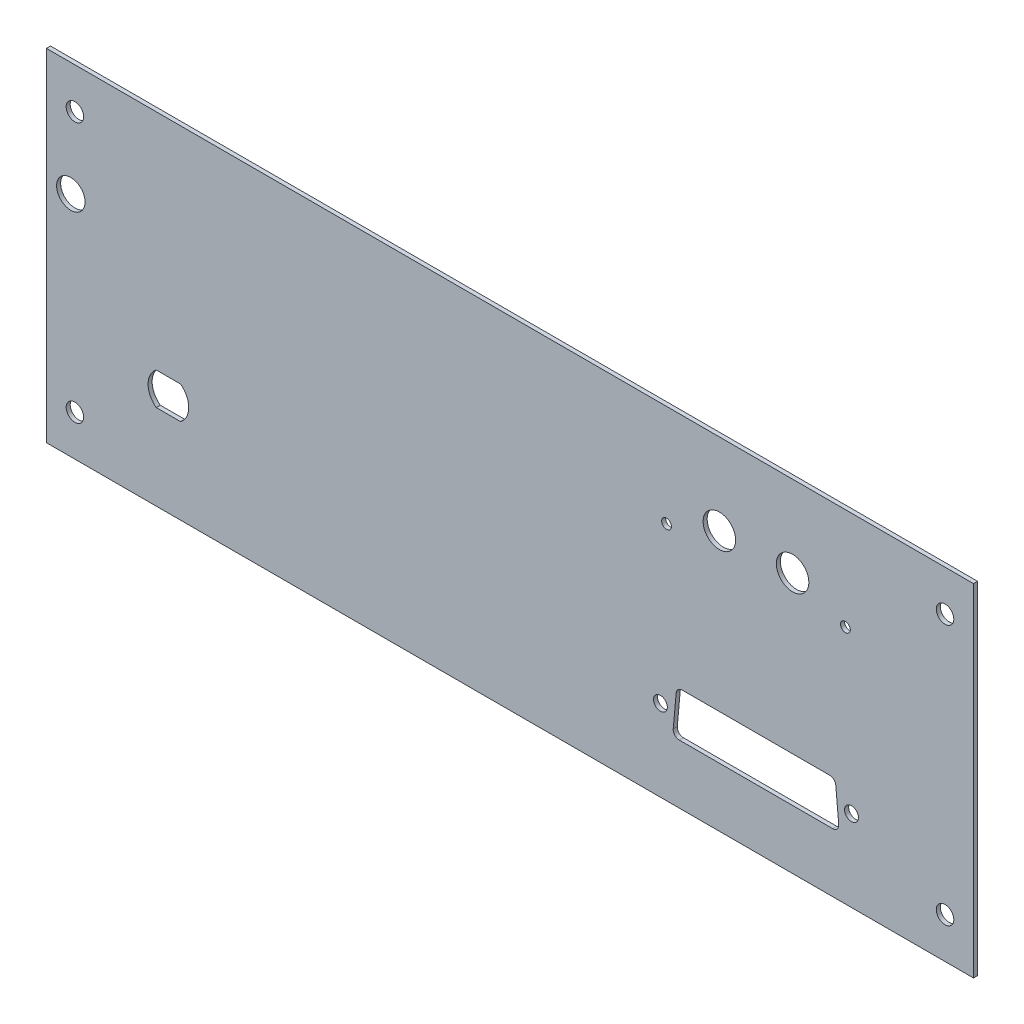
ISO-10303-21;
HEADER;
FILE_DESCRIPTION(('STEP AP214'),'2;1');
FILE_NAME('part.step','',(''),(''),'','','');
FILE_SCHEMA(('AUTOMOTIVE_DESIGN { 1 0 10303 214 1 1 1 1 }'));
ENDSEC;
DATA;
#1=APPLICATION_CONTEXT('core data for automotive mechanical design processes');
#2=APPLICATION_PROTOCOL_DEFINITION('international standard','automotive_design',2000,#1);
#3=PRODUCT_CONTEXT('',#1,'mechanical');
#4=PRODUCT('Part','Part','',(#3));
#5=PRODUCT_RELATED_PRODUCT_CATEGORY('part','',(#4));
#6=PRODUCT_DEFINITION_FORMATION('','',#4);
#7=PRODUCT_DEFINITION_CONTEXT('part definition',#1,'design');
#8=PRODUCT_DEFINITION('design','',#6,#7);
#9=PRODUCT_DEFINITION_SHAPE('','',#8);
#10=(LENGTH_UNIT() NAMED_UNIT(*) SI_UNIT(.MILLI.,.METRE.));
#11=(NAMED_UNIT(*) PLANE_ANGLE_UNIT() SI_UNIT($,.RADIAN.));
#12=(NAMED_UNIT(*) SI_UNIT($,.STERADIAN.) SOLID_ANGLE_UNIT());
#13=UNCERTAINTY_MEASURE_WITH_UNIT(LENGTH_MEASURE(1.E-05),#10,'distance_accuracy_value','');
#14=(GEOMETRIC_REPRESENTATION_CONTEXT(3) GLOBAL_UNCERTAINTY_ASSIGNED_CONTEXT((#13)) GLOBAL_UNIT_ASSIGNED_CONTEXT((#10,
#11,#12)) REPRESENTATION_CONTEXT('',''));
#15=CARTESIAN_POINT('',(0.,0.,0.));
#16=DIRECTION('',(0.,0.,1.));
#17=DIRECTION('',(1.,0.,0.));
#18=AXIS2_PLACEMENT_3D('',#15,#16,#17);
#19=CARTESIAN_POINT('',(-114.,-42.,1.));
#20=DIRECTION('',(0.,0.,-1.));
#21=DIRECTION('',(-1.,0.,0.));
#22=AXIS2_PLACEMENT_3D('',#19,#20,#21);
#23=PLANE('',#22);
#24=DIRECTION('',(1.,0.,0.));
#25=VECTOR('',#24,1.);
#26=CARTESIAN_POINT('',(-87.,-21.,1.));
#27=LINE('',#26,#25);
#28=CARTESIAN_POINT('',(-87.,-21.,1.));
#29=VERTEX_POINT('',#28);
#30=CARTESIAN_POINT('',(-81.,-21.,1.));
#31=VERTEX_POINT('',#30);
#32=EDGE_CURVE('E172',#29,#31,#27,.T.);
#33=ORIENTED_EDGE('',*,*,#32,.F.);
#34=CARTESIAN_POINT('',(-84.,-17.,1.));
#35=DIRECTION('',(0.,0.,1.));
#36=DIRECTION('',(1.,0.,0.));
#37=AXIS2_PLACEMENT_3D('',#34,#35,#36);
#38=CIRCLE('',#37,5.);
#39=CARTESIAN_POINT('',(-87.,-13.,1.));
#40=VERTEX_POINT('',#39);
#41=EDGE_CURVE('E48',#40,#29,#38,.T.);
#42=ORIENTED_EDGE('',*,*,#41,.F.);
#43=DIRECTION('',(-1.,0.,0.));
#44=VECTOR('',#43,1.);
#45=CARTESIAN_POINT('',(-87.,-13.,1.));
#46=LINE('',#45,#44);
#47=CARTESIAN_POINT('',(-81.,-13.,1.));
#48=VERTEX_POINT('',#47);
#49=EDGE_CURVE('E163',#48,#40,#46,.T.);
#50=ORIENTED_EDGE('',*,*,#49,.F.);
#51=CARTESIAN_POINT('',(-84.,-17.,1.));
#52=DIRECTION('',(0.,0.,1.));
#53=DIRECTION('',(1.,0.,0.));
#54=AXIS2_PLACEMENT_3D('',#51,#52,#53);
#55=CIRCLE('',#54,5.);
#56=EDGE_CURVE('E166',#31,#48,#55,.T.);
#57=ORIENTED_EDGE('',*,*,#56,.F.);
#58=EDGE_LOOP('',(#33,#42,#50,#57));
#59=FACE_BOUND('',#58,.T.);
#60=CARTESIAN_POINT('',(-108.,14.,1.));
#61=DIRECTION('',(0.,0.,1.));
#62=DIRECTION('',(1.,0.,0.));
#63=AXIS2_PLACEMENT_3D('',#60,#61,#62);
#64=CIRCLE('',#63,3.50000000000001);
#65=CARTESIAN_POINT('',(-104.5,14.,1.));
#66=VERTEX_POINT('',#65);
#67=EDGE_CURVE('E178',#66,#66,#64,.T.);
#68=ORIENTED_EDGE('',*,*,#67,.F.);
#69=EDGE_LOOP('',(#68));
#70=FACE_BOUND('',#69,.T.);
#71=CARTESIAN_POINT('',(69.5,22.,1.));
#72=DIRECTION('',(0.,0.,1.));
#73=DIRECTION('',(1.,0.,0.));
#74=AXIS2_PLACEMENT_3D('',#71,#72,#73);
#75=CIRCLE('',#74,4.00000000000002);
#76=CARTESIAN_POINT('',(73.5,22.,1.));
#77=VERTEX_POINT('',#76);
#78=EDGE_CURVE('E185',#77,#77,#75,.T.);
#79=ORIENTED_EDGE('',*,*,#78,.F.);
#80=EDGE_LOOP('',(#79));
#81=FACE_BOUND('',#80,.T.);
#82=CARTESIAN_POINT('',(51.5,22.,1.));
#83=DIRECTION('',(0.,0.,1.));
#84=DIRECTION('',(1.,0.,0.));
#85=AXIS2_PLACEMENT_3D('',#82,#83,#84);
#86=CIRCLE('',#85,4.00000000000001);
#87=CARTESIAN_POINT('',(55.5,22.,1.));
#88=VERTEX_POINT('',#87);
#89=EDGE_CURVE('E190',#88,#88,#86,.T.);
#90=ORIENTED_EDGE('',*,*,#89,.F.);
#91=EDGE_LOOP('',(#90));
#92=FACE_BOUND('',#91,.T.);
#93=CARTESIAN_POINT('',(82.5,17.,1.));
#94=DIRECTION('',(0.,0.,1.));
#95=DIRECTION('',(1.,0.,0.));
#96=AXIS2_PLACEMENT_3D('',#93,#94,#95);
#97=CIRCLE('',#96,1.20000000000002);
#98=CARTESIAN_POINT('',(83.7,17.,1.));
#99=VERTEX_POINT('',#98);
#100=EDGE_CURVE('E194',#99,#99,#97,.T.);
#101=ORIENTED_EDGE('',*,*,#100,.F.);
#102=EDGE_LOOP('',(#101));
#103=FACE_BOUND('',#102,.T.);
#104=CARTESIAN_POINT('',(38.5,17.,1.));
#105=DIRECTION('',(0.,0.,1.));
#106=DIRECTION('',(1.,0.,0.));
#107=AXIS2_PLACEMENT_3D('',#104,#105,#106);
#108=CIRCLE('',#107,1.20000000000001);
#109=CARTESIAN_POINT('',(39.7,17.,1.));
#110=VERTEX_POINT('',#109);
#111=EDGE_CURVE('E198',#110,#110,#108,.T.);
#112=ORIENTED_EDGE('',*,*,#111,.F.);
#113=EDGE_LOOP('',(#112));
#114=FACE_BOUND('',#113,.T.);
#115=DIRECTION('',(1.,0.,0.));
#116=VECTOR('',#115,1.);
#117=CARTESIAN_POINT('',(41.6425492296165,-27.5,1.));
#118=LINE('',#117,#116);
#119=CARTESIAN_POINT('',(41.6425492296165,-27.5,1.));
#120=VERTEX_POINT('',#119);
#121=CARTESIAN_POINT('',(79.3574507703836,-27.5,1.));
#122=VERTEX_POINT('',#121);
#123=EDGE_CURVE('E204',#120,#122,#118,.T.);
#124=ORIENTED_EDGE('',*,*,#123,.F.);
#125=CARTESIAN_POINT('',(41.6425492296165,-26.,1.));
#126=DIRECTION('',(0.,0.,1.));
#127=DIRECTION('',(-1.,0.,0.));
#128=AXIS2_PLACEMENT_3D('',#125,#126,#127);
#129=CIRCLE('',#128,1.5);
#130=CARTESIAN_POINT('',(40.1487094199149,-25.8641963809362,1.));
#131=VERTEX_POINT('',#130);
#132=EDGE_CURVE('E202',#131,#120,#129,.T.);
#133=ORIENTED_EDGE('',*,*,#132,.F.);
#134=DIRECTION('',(-0.090535746042518,-0.995893206467704,0.));
#135=VECTOR('',#134,1.);
#136=CARTESIAN_POINT('',(40.1487094199149,-25.8641963809362,1.));
#137=LINE('',#136,#135);
#138=CARTESIAN_POINT('',(40.8759821471876,-17.8641963809362,1.));
#139=VERTEX_POINT('',#138);
#140=EDGE_CURVE('E222',#139,#131,#137,.T.);
#141=ORIENTED_EDGE('',*,*,#140,.F.);
#142=CARTESIAN_POINT('',(42.3698219568892,-18.,1.));
#143=DIRECTION('',(0.,0.,1.));
#144=DIRECTION('',(1.,0.,0.));
#145=AXIS2_PLACEMENT_3D('',#142,#143,#144);
#146=CIRCLE('',#145,1.5);
#147=CARTESIAN_POINT('',(42.3698219568892,-16.5,1.));
#148=VERTEX_POINT('',#147);
#149=EDGE_CURVE('E219',#148,#139,#146,.T.);
#150=ORIENTED_EDGE('',*,*,#149,.F.);
#151=DIRECTION('',(-1.,0.,0.));
#152=VECTOR('',#151,1.);
#153=CARTESIAN_POINT('',(42.3698219568892,-16.5,1.));
#154=LINE('',#153,#152);
#155=CARTESIAN_POINT('',(78.6301780431108,-16.5,1.));
#156=VERTEX_POINT('',#155);
#157=EDGE_CURVE('E216',#156,#148,#154,.T.);
#158=ORIENTED_EDGE('',*,*,#157,.F.);
#159=CARTESIAN_POINT('',(78.6301780431108,-18.,1.));
#160=DIRECTION('',(0.,0.,1.));
#161=DIRECTION('',(1.,0.,0.));
#162=AXIS2_PLACEMENT_3D('',#159,#160,#161);
#163=CIRCLE('',#162,1.5);
#164=CARTESIAN_POINT('',(80.1240178528124,-17.8641963809362,1.));
#165=VERTEX_POINT('',#164);
#166=EDGE_CURVE('E213',#165,#156,#163,.T.);
#167=ORIENTED_EDGE('',*,*,#166,.F.);
#168=DIRECTION('',(-0.0905357460425171,0.995893206467704,0.));
#169=VECTOR('',#168,1.);
#170=CARTESIAN_POINT('',(80.8512905800851,-25.8641963809362,1.));
#171=LINE('',#170,#169);
#172=CARTESIAN_POINT('',(80.8512905800851,-25.8641963809362,1.));
#173=VERTEX_POINT('',#172);
#174=EDGE_CURVE('E210',#173,#165,#171,.T.);
#175=ORIENTED_EDGE('',*,*,#174,.F.);
#176=CARTESIAN_POINT('',(79.3574507703836,-26.,1.));
#177=DIRECTION('',(0.,0.,1.));
#178=DIRECTION('',(1.,0.,0.));
#179=AXIS2_PLACEMENT_3D('',#176,#177,#178);
#180=CIRCLE('',#179,1.49999999999999);
#181=EDGE_CURVE('E207',#122,#173,#180,.T.);
#182=ORIENTED_EDGE('',*,*,#181,.F.);
#183=EDGE_LOOP('',(#124,#133,#141,#150,#158,#167,#175,#182));
#184=FACE_BOUND('',#183,.T.);
#185=CARTESIAN_POINT('',(84.,-22.,1.));
#186=DIRECTION('',(0.,0.,1.));
#187=DIRECTION('',(1.,0.,0.));
#188=AXIS2_PLACEMENT_3D('',#185,#186,#187);
#189=CIRCLE('',#188,1.69999999999996);
#190=CARTESIAN_POINT('',(85.7,-22.,1.));
#191=VERTEX_POINT('',#190);
#192=EDGE_CURVE('E228',#191,#191,#189,.T.);
#193=ORIENTED_EDGE('',*,*,#192,.F.);
#194=EDGE_LOOP('',(#193));
#195=FACE_BOUND('',#194,.T.);
#196=CARTESIAN_POINT('',(37.,-22.,1.));
#197=DIRECTION('',(0.,0.,1.));
#198=DIRECTION('',(1.,0.,0.));
#199=AXIS2_PLACEMENT_3D('',#196,#197,#198);
#200=CIRCLE('',#199,1.70000000000001);
#201=CARTESIAN_POINT('',(38.7,-22.,1.));
#202=VERTEX_POINT('',#201);
#203=EDGE_CURVE('E246',#202,#202,#200,.T.);
#204=ORIENTED_EDGE('',*,*,#203,.F.);
#205=EDGE_LOOP('',(#204));
#206=FACE_BOUND('',#205,.T.);
#207=CARTESIAN_POINT('',(-107.,-32.,1.));
#208=DIRECTION('',(0.,0.,1.));
#209=DIRECTION('',(1.,0.,0.));
#210=AXIS2_PLACEMENT_3D('',#207,#208,#209);
#211=CIRCLE('',#210,2.15);
#212=CARTESIAN_POINT('',(-104.85,-32.,1.));
#213=VERTEX_POINT('',#212);
#214=EDGE_CURVE('E257',#213,#213,#211,.T.);
#215=ORIENTED_EDGE('',*,*,#214,.F.);
#216=EDGE_LOOP('',(#215));
#217=FACE_BOUND('',#216,.T.);
#218=CARTESIAN_POINT('',(107.,32.,1.));
#219=DIRECTION('',(0.,0.,1.));
#220=DIRECTION('',(1.,0.,0.));
#221=AXIS2_PLACEMENT_3D('',#218,#219,#220);
#222=CIRCLE('',#221,2.15);
#223=CARTESIAN_POINT('',(109.15,32.,1.));
#224=VERTEX_POINT('',#223);
#225=EDGE_CURVE('E269',#224,#224,#222,.T.);
#226=ORIENTED_EDGE('',*,*,#225,.F.);
#227=EDGE_LOOP('',(#226));
#228=FACE_BOUND('',#227,.T.);
#229=DIRECTION('',(0.,-1.,0.));
#230=VECTOR('',#229,1.);
#231=CARTESIAN_POINT('',(-114.,-42.,1.));
#232=LINE('',#231,#230);
#233=CARTESIAN_POINT('',(-114.,42.,1.));
#234=VERTEX_POINT('',#233);
#235=CARTESIAN_POINT('',(-114.,-42.,1.));
#236=VERTEX_POINT('',#235);
#237=EDGE_CURVE('E275',#234,#236,#232,.T.);
#238=ORIENTED_EDGE('',*,*,#237,.T.);
#239=DIRECTION('',(1.,0.,0.));
#240=VECTOR('',#239,1.);
#241=CARTESIAN_POINT('',(-114.,-42.,1.));
#242=LINE('',#241,#240);
#243=CARTESIAN_POINT('',(114.,-42.,1.));
#244=VERTEX_POINT('',#243);
#245=EDGE_CURVE('E278',#236,#244,#242,.T.);
#246=ORIENTED_EDGE('',*,*,#245,.T.);
#247=DIRECTION('',(0.,1.,0.));
#248=VECTOR('',#247,1.);
#249=CARTESIAN_POINT('',(114.,-42.,1.));
#250=LINE('',#249,#248);
#251=CARTESIAN_POINT('',(114.,42.,1.));
#252=VERTEX_POINT('',#251);
#253=EDGE_CURVE('E281',#244,#252,#250,.T.);
#254=ORIENTED_EDGE('',*,*,#253,.T.);
#255=DIRECTION('',(-1.,0.,0.));
#256=VECTOR('',#255,1.);
#257=CARTESIAN_POINT('',(-114.,42.,1.));
#258=LINE('',#257,#256);
#259=EDGE_CURVE('E283',#252,#234,#258,.T.);
#260=ORIENTED_EDGE('',*,*,#259,.T.);
#261=EDGE_LOOP('',(#238,#246,#254,#260));
#262=FACE_BOUND('',#261,.T.);
#263=CARTESIAN_POINT('',(-107.,32.,1.));
#264=DIRECTION('',(0.,0.,1.));
#265=DIRECTION('',(-1.,0.,0.));
#266=AXIS2_PLACEMENT_3D('',#263,#264,#265);
#267=CIRCLE('',#266,2.15);
#268=CARTESIAN_POINT('',(-109.15,32.,1.));
#269=VERTEX_POINT('',#268);
#270=EDGE_CURVE('E263',#269,#269,#267,.T.);
#271=ORIENTED_EDGE('',*,*,#270,.F.);
#272=EDGE_LOOP('',(#271));
#273=FACE_BOUND('',#272,.T.);
#274=CARTESIAN_POINT('',(107.,-32.,1.));
#275=DIRECTION('',(0.,0.,1.));
#276=DIRECTION('',(-1.,0.,0.));
#277=AXIS2_PLACEMENT_3D('',#274,#275,#276);
#278=CIRCLE('',#277,2.15);
#279=CARTESIAN_POINT('',(104.85,-32.,1.));
#280=VERTEX_POINT('',#279);
#281=EDGE_CURVE('E250',#280,#280,#278,.T.);
#282=ORIENTED_EDGE('',*,*,#281,.F.);
#283=EDGE_LOOP('',(#282));
#284=FACE_BOUND('',#283,.T.);
#285=ADVANCED_FACE('F31',(#59,#70,#81,#92,#103,#114,#184,#195,#206,#217,#228,#262,#273,#284),
#23,.F.);
#286=CARTESIAN_POINT('',(-114.,-42.,0.));
#287=DIRECTION('',(0.,0.,-1.));
#288=DIRECTION('',(-1.,0.,0.));
#289=AXIS2_PLACEMENT_3D('',#286,#287,#288);
#290=PLANE('',#289);
#291=CARTESIAN_POINT('',(-84.,-17.,0.));
#292=DIRECTION('',(0.,0.,1.));
#293=DIRECTION('',(1.,0.,0.));
#294=AXIS2_PLACEMENT_3D('',#291,#292,#293);
#295=CIRCLE('',#294,5.);
#296=CARTESIAN_POINT('',(-87.,-13.,0.));
#297=VERTEX_POINT('',#296);
#298=CARTESIAN_POINT('',(-87.,-21.,0.));
#299=VERTEX_POINT('',#298);
#300=EDGE_CURVE('E147',#297,#299,#295,.T.);
#301=ORIENTED_EDGE('',*,*,#300,.T.);
#302=DIRECTION('',(1.,0.,0.));
#303=VECTOR('',#302,1.);
#304=CARTESIAN_POINT('',(-87.,-21.,0.));
#305=LINE('',#304,#303);
#306=CARTESIAN_POINT('',(-81.,-21.,0.));
#307=VERTEX_POINT('',#306);
#308=EDGE_CURVE('E156',#299,#307,#305,.T.);
#309=ORIENTED_EDGE('',*,*,#308,.T.);
#310=CARTESIAN_POINT('',(-84.,-17.,0.));
#311=DIRECTION('',(0.,0.,1.));
#312=DIRECTION('',(1.,0.,0.));
#313=AXIS2_PLACEMENT_3D('',#310,#311,#312);
#314=CIRCLE('',#313,5.);
#315=CARTESIAN_POINT('',(-81.,-13.,0.));
#316=VERTEX_POINT('',#315);
#317=EDGE_CURVE('E56',#307,#316,#314,.T.);
#318=ORIENTED_EDGE('',*,*,#317,.T.);
#319=DIRECTION('',(-1.,0.,0.));
#320=VECTOR('',#319,1.);
#321=CARTESIAN_POINT('',(-87.,-13.,0.));
#322=LINE('',#321,#320);
#323=EDGE_CURVE('E153',#316,#297,#322,.T.);
#324=ORIENTED_EDGE('',*,*,#323,.T.);
#325=EDGE_LOOP('',(#301,#309,#318,#324));
#326=FACE_BOUND('',#325,.T.);
#327=CARTESIAN_POINT('',(-108.,14.,0.));
#328=DIRECTION('',(0.,0.,1.));
#329=DIRECTION('',(1.,0.,0.));
#330=AXIS2_PLACEMENT_3D('',#327,#328,#329);
#331=CIRCLE('',#330,3.50000000000001);
#332=CARTESIAN_POINT('',(-104.5,14.,0.));
#333=VERTEX_POINT('',#332);
#334=EDGE_CURVE('E182',#333,#333,#331,.T.);
#335=ORIENTED_EDGE('',*,*,#334,.T.);
#336=EDGE_LOOP('',(#335));
#337=FACE_BOUND('',#336,.T.);
#338=CARTESIAN_POINT('',(69.5,22.,0.));
#339=DIRECTION('',(0.,0.,-1.));
#340=DIRECTION('',(-1.,0.,0.));
#341=AXIS2_PLACEMENT_3D('',#338,#339,#340);
#342=CIRCLE('',#341,4.00000000000002);
#343=CARTESIAN_POINT('',(65.5,22.,0.));
#344=VERTEX_POINT('',#343);
#345=EDGE_CURVE('E35',#344,#344,#342,.T.);
#346=ORIENTED_EDGE('',*,*,#345,.F.);
#347=EDGE_LOOP('',(#346));
#348=FACE_BOUND('',#347,.T.);
#349=CARTESIAN_POINT('',(51.5,22.,0.));
#350=DIRECTION('',(0.,0.,-1.));
#351=DIRECTION('',(-1.,0.,0.));
#352=AXIS2_PLACEMENT_3D('',#349,#350,#351);
#353=CIRCLE('',#352,4.00000000000001);
#354=CARTESIAN_POINT('',(47.5,22.,0.));
#355=VERTEX_POINT('',#354);
#356=EDGE_CURVE('E193',#355,#355,#353,.T.);
#357=ORIENTED_EDGE('',*,*,#356,.F.);
#358=EDGE_LOOP('',(#357));
#359=FACE_BOUND('',#358,.T.);
#360=CARTESIAN_POINT('',(82.5,17.,0.));
#361=DIRECTION('',(0.,0.,-1.));
#362=DIRECTION('',(-1.,0.,0.));
#363=AXIS2_PLACEMENT_3D('',#360,#361,#362);
#364=CIRCLE('',#363,1.20000000000002);
#365=CARTESIAN_POINT('',(81.3,17.,0.));
#366=VERTEX_POINT('',#365);
#367=EDGE_CURVE('E197',#366,#366,#364,.T.);
#368=ORIENTED_EDGE('',*,*,#367,.F.);
#369=EDGE_LOOP('',(#368));
#370=FACE_BOUND('',#369,.T.);
#371=CARTESIAN_POINT('',(38.5,17.,0.));
#372=DIRECTION('',(0.,0.,-1.));
#373=DIRECTION('',(-1.,0.,0.));
#374=AXIS2_PLACEMENT_3D('',#371,#372,#373);
#375=CIRCLE('',#374,1.20000000000001);
#376=CARTESIAN_POINT('',(37.3,17.,0.));
#377=VERTEX_POINT('',#376);
#378=EDGE_CURVE('E201',#377,#377,#375,.T.);
#379=ORIENTED_EDGE('',*,*,#378,.F.);
#380=EDGE_LOOP('',(#379));
#381=FACE_BOUND('',#380,.T.);
#382=CARTESIAN_POINT('',(41.6425492296165,-26.,0.));
#383=DIRECTION('',(0.,0.,-1.));
#384=DIRECTION('',(-1.,0.,0.));
#385=AXIS2_PLACEMENT_3D('',#382,#383,#384);
#386=CIRCLE('',#385,1.5);
#387=CARTESIAN_POINT('',(41.6425492296165,-27.5,0.));
#388=VERTEX_POINT('',#387);
#389=CARTESIAN_POINT('',(40.1487094199149,-25.8641963809362,0.));
#390=VERTEX_POINT('',#389);
#391=EDGE_CURVE('E11',#388,#390,#386,.T.);
#392=ORIENTED_EDGE('',*,*,#391,.F.);
#393=DIRECTION('',(-1.,0.,0.));
#394=VECTOR('',#393,1.);
#395=CARTESIAN_POINT('',(-114.,-27.5,0.));
#396=LINE('',#395,#394);
#397=CARTESIAN_POINT('',(79.3574507703836,-27.5,0.));
#398=VERTEX_POINT('',#397);
#399=EDGE_CURVE('E304',#398,#388,#396,.T.);
#400=ORIENTED_EDGE('',*,*,#399,.F.);
#401=CARTESIAN_POINT('',(79.3574507703836,-26.,0.));
#402=DIRECTION('',(0.,0.,-1.));
#403=DIRECTION('',(-1.,0.,0.));
#404=AXIS2_PLACEMENT_3D('',#401,#402,#403);
#405=CIRCLE('',#404,1.49999999999999);
#406=CARTESIAN_POINT('',(80.8512905800851,-25.8641963809362,0.));
#407=VERTEX_POINT('',#406);
#408=EDGE_CURVE('E310',#407,#398,#405,.T.);
#409=ORIENTED_EDGE('',*,*,#408,.F.);
#410=DIRECTION('',(0.0905357460425171,-0.995893206467704,0.));
#411=VECTOR('',#410,1.);
#412=CARTESIAN_POINT('',(80.7090163934426,-24.2991803278691,0.));
#413=LINE('',#412,#411);
#414=CARTESIAN_POINT('',(80.1240178528124,-17.8641963809362,0.));
#415=VERTEX_POINT('',#414);
#416=EDGE_CURVE('E313',#415,#407,#413,.T.);
#417=ORIENTED_EDGE('',*,*,#416,.F.);
#418=CARTESIAN_POINT('',(78.6301780431108,-18.,0.));
#419=DIRECTION('',(0.,0.,-1.));
#420=DIRECTION('',(-1.,0.,0.));
#421=AXIS2_PLACEMENT_3D('',#418,#419,#420);
#422=CIRCLE('',#421,1.5);
#423=CARTESIAN_POINT('',(78.6301780431108,-16.5,0.));
#424=VERTEX_POINT('',#423);
#425=EDGE_CURVE('E315',#424,#415,#422,.T.);
#426=ORIENTED_EDGE('',*,*,#425,.F.);
#427=DIRECTION('',(1.,0.,0.));
#428=VECTOR('',#427,1.);
#429=CARTESIAN_POINT('',(-114.,-16.5,0.));
#430=LINE('',#429,#428);
#431=CARTESIAN_POINT('',(42.3698219568892,-16.5,0.));
#432=VERTEX_POINT('',#431);
#433=EDGE_CURVE('E317',#432,#424,#430,.T.);
#434=ORIENTED_EDGE('',*,*,#433,.F.);
#435=CARTESIAN_POINT('',(42.3698219568892,-18.,0.));
#436=DIRECTION('',(0.,0.,-1.));
#437=DIRECTION('',(-1.,0.,0.));
#438=AXIS2_PLACEMENT_3D('',#435,#436,#437);
#439=CIRCLE('',#438,1.5);
#440=CARTESIAN_POINT('',(40.8759821471876,-17.8641963809362,0.));
#441=VERTEX_POINT('',#440);
#442=EDGE_CURVE('E319',#441,#432,#439,.T.);
#443=ORIENTED_EDGE('',*,*,#442,.F.);
#444=DIRECTION('',(0.090535746042518,0.995893206467704,0.));
#445=VECTOR('',#444,1.);
#446=CARTESIAN_POINT('',(37.4303278688525,-55.7663934426229,0.));
#447=LINE('',#446,#445);
#448=EDGE_CURVE('E40',#390,#441,#447,.T.);
#449=ORIENTED_EDGE('',*,*,#448,.F.);
#450=EDGE_LOOP('',(#392,#400,#409,#417,#426,#434,#443,#449));
#451=FACE_BOUND('',#450,.T.);
#452=CARTESIAN_POINT('',(84.,-22.,0.));
#453=DIRECTION('',(0.,0.,-1.));
#454=DIRECTION('',(-1.,0.,0.));
#455=AXIS2_PLACEMENT_3D('',#452,#453,#454);
#456=CIRCLE('',#455,1.69999999999996);
#457=CARTESIAN_POINT('',(82.3000000000001,-22.,0.));
#458=VERTEX_POINT('',#457);
#459=EDGE_CURVE('E245',#458,#458,#456,.T.);
#460=ORIENTED_EDGE('',*,*,#459,.F.);
#461=EDGE_LOOP('',(#460));
#462=FACE_BOUND('',#461,.T.);
#463=CARTESIAN_POINT('',(37.,-22.,0.));
#464=DIRECTION('',(0.,0.,-1.));
#465=DIRECTION('',(-1.,0.,0.));
#466=AXIS2_PLACEMENT_3D('',#463,#464,#465);
#467=CIRCLE('',#466,1.70000000000001);
#468=CARTESIAN_POINT('',(35.3,-22.,0.));
#469=VERTEX_POINT('',#468);
#470=EDGE_CURVE('E249',#469,#469,#467,.T.);
#471=ORIENTED_EDGE('',*,*,#470,.F.);
#472=EDGE_LOOP('',(#471));
#473=FACE_BOUND('',#472,.T.);
#474=CARTESIAN_POINT('',(-107.,-32.,0.));
#475=DIRECTION('',(0.,0.,1.));
#476=DIRECTION('',(1.,0.,0.));
#477=AXIS2_PLACEMENT_3D('',#474,#475,#476);
#478=CIRCLE('',#477,2.15);
#479=CARTESIAN_POINT('',(-104.85,-32.,0.));
#480=VERTEX_POINT('',#479);
#481=EDGE_CURVE('E253',#480,#480,#478,.T.);
#482=ORIENTED_EDGE('',*,*,#481,.T.);
#483=EDGE_LOOP('',(#482));
#484=FACE_BOUND('',#483,.T.);
#485=CARTESIAN_POINT('',(107.,32.,0.));
#486=DIRECTION('',(0.,0.,1.));
#487=DIRECTION('',(1.,0.,0.));
#488=AXIS2_PLACEMENT_3D('',#485,#486,#487);
#489=CIRCLE('',#488,2.15);
#490=CARTESIAN_POINT('',(109.15,32.,0.));
#491=VERTEX_POINT('',#490);
#492=EDGE_CURVE('E266',#491,#491,#489,.T.);
#493=ORIENTED_EDGE('',*,*,#492,.T.);
#494=EDGE_LOOP('',(#493));
#495=FACE_BOUND('',#494,.T.);
#496=DIRECTION('',(0.,-1.,0.));
#497=VECTOR('',#496,1.);
#498=CARTESIAN_POINT('',(-114.,-42.,0.));
#499=LINE('',#498,#497);
#500=CARTESIAN_POINT('',(-114.,42.,0.));
#501=VERTEX_POINT('',#500);
#502=CARTESIAN_POINT('',(-114.,-42.,0.));
#503=VERTEX_POINT('',#502);
#504=EDGE_CURVE('E272',#501,#503,#499,.T.);
#505=ORIENTED_EDGE('',*,*,#504,.F.);
#506=DIRECTION('',(-1.,0.,0.));
#507=VECTOR('',#506,1.);
#508=CARTESIAN_POINT('',(-114.,42.,0.));
#509=LINE('',#508,#507);
#510=CARTESIAN_POINT('',(114.,42.,0.));
#511=VERTEX_POINT('',#510);
#512=EDGE_CURVE('E279',#511,#501,#509,.T.);
#513=ORIENTED_EDGE('',*,*,#512,.F.);
#514=DIRECTION('',(0.,1.,0.));
#515=VECTOR('',#514,1.);
#516=CARTESIAN_POINT('',(114.,-42.,0.));
#517=LINE('',#516,#515);
#518=CARTESIAN_POINT('',(114.,-42.,0.));
#519=VERTEX_POINT('',#518);
#520=EDGE_CURVE('E290',#519,#511,#517,.T.);
#521=ORIENTED_EDGE('',*,*,#520,.F.);
#522=DIRECTION('',(1.,0.,0.));
#523=VECTOR('',#522,1.);
#524=CARTESIAN_POINT('',(-114.,-42.,0.));
#525=LINE('',#524,#523);
#526=EDGE_CURVE('E288',#503,#519,#525,.T.);
#527=ORIENTED_EDGE('',*,*,#526,.F.);
#528=EDGE_LOOP('',(#505,#513,#521,#527));
#529=FACE_BOUND('',#528,.T.);
#530=CARTESIAN_POINT('',(-107.,32.,0.));
#531=DIRECTION('',(0.,0.,1.));
#532=DIRECTION('',(-1.,0.,0.));
#533=AXIS2_PLACEMENT_3D('',#530,#531,#532);
#534=CIRCLE('',#533,2.15);
#535=CARTESIAN_POINT('',(-109.15,32.,0.));
#536=VERTEX_POINT('',#535);
#537=EDGE_CURVE('E260',#536,#536,#534,.T.);
#538=ORIENTED_EDGE('',*,*,#537,.T.);
#539=EDGE_LOOP('',(#538));
#540=FACE_BOUND('',#539,.T.);
#541=CARTESIAN_POINT('',(107.,-32.,0.));
#542=DIRECTION('',(0.,0.,1.));
#543=DIRECTION('',(-1.,0.,0.));
#544=AXIS2_PLACEMENT_3D('',#541,#542,#543);
#545=CIRCLE('',#544,2.15);
#546=CARTESIAN_POINT('',(104.85,-32.,0.));
#547=VERTEX_POINT('',#546);
#548=EDGE_CURVE('E254',#547,#547,#545,.T.);
#549=ORIENTED_EDGE('',*,*,#548,.T.);
#550=EDGE_LOOP('',(#549));
#551=FACE_BOUND('',#550,.T.);
#552=ADVANCED_FACE('F160',(#326,#337,#348,#359,#370,#381,#451,#462,#473,#484,#495,#529,#540,
#551),#290,.T.);
#553=CARTESIAN_POINT('',(-114.,-42.,1.));
#554=DIRECTION('',(1.,0.,0.));
#555=DIRECTION('',(0.,0.,-1.));
#556=AXIS2_PLACEMENT_3D('',#553,#554,#555);
#557=PLANE('',#556);
#558=ORIENTED_EDGE('',*,*,#504,.T.);
#559=DIRECTION('',(0.,0.,-1.));
#560=VECTOR('',#559,1.);
#561=CARTESIAN_POINT('',(-114.,-42.,1.));
#562=LINE('',#561,#560);
#563=EDGE_CURVE('E301',#236,#503,#562,.T.);
#564=ORIENTED_EDGE('',*,*,#563,.F.);
#565=ORIENTED_EDGE('',*,*,#237,.F.);
#566=DIRECTION('',(0.,0.,-1.));
#567=VECTOR('',#566,1.);
#568=CARTESIAN_POINT('',(-114.,42.,1.));
#569=LINE('',#568,#567);
#570=EDGE_CURVE('E285',#234,#501,#569,.T.);
#571=ORIENTED_EDGE('',*,*,#570,.T.);
#572=EDGE_LOOP('',(#558,#564,#565,#571));
#573=FACE_BOUND('',#572,.T.);
#574=ADVANCED_FACE('F33',(#573),#557,.F.);
#575=CARTESIAN_POINT('',(-114.,-42.,1.));
#576=DIRECTION('',(0.,1.,0.));
#577=DIRECTION('',(0.,0.,1.));
#578=AXIS2_PLACEMENT_3D('',#575,#576,#577);
#579=PLANE('',#578);
#580=ORIENTED_EDGE('',*,*,#526,.T.);
#581=DIRECTION('',(0.,0.,-1.));
#582=VECTOR('',#581,1.);
#583=CARTESIAN_POINT('',(114.,-42.,1.));
#584=LINE('',#583,#582);
#585=EDGE_CURVE('E298',#244,#519,#584,.T.);
#586=ORIENTED_EDGE('',*,*,#585,.F.);
#587=ORIENTED_EDGE('',*,*,#245,.F.);
#588=ORIENTED_EDGE('',*,*,#563,.T.);
#589=EDGE_LOOP('',(#580,#586,#587,#588));
#590=FACE_BOUND('',#589,.T.);
#591=ADVANCED_FACE('F389',(#590),#579,.F.);
#592=CARTESIAN_POINT('',(114.,-42.,1.));
#593=DIRECTION('',(-1.,0.,0.));
#594=DIRECTION('',(0.,0.,1.));
#595=AXIS2_PLACEMENT_3D('',#592,#593,#594);
#596=PLANE('',#595);
#597=ORIENTED_EDGE('',*,*,#520,.T.);
#598=DIRECTION('',(0.,0.,-1.));
#599=VECTOR('',#598,1.);
#600=CARTESIAN_POINT('',(114.,42.,1.));
#601=LINE('',#600,#599);
#602=EDGE_CURVE('E295',#252,#511,#601,.T.);
#603=ORIENTED_EDGE('',*,*,#602,.F.);
#604=ORIENTED_EDGE('',*,*,#253,.F.);
#605=ORIENTED_EDGE('',*,*,#585,.T.);
#606=EDGE_LOOP('',(#597,#603,#604,#605));
#607=FACE_BOUND('',#606,.T.);
#608=ADVANCED_FACE('F386',(#607),#596,.F.);
#609=CARTESIAN_POINT('',(-114.,42.,1.));
#610=DIRECTION('',(0.,-1.,0.));
#611=DIRECTION('',(1.,0.,0.));
#612=AXIS2_PLACEMENT_3D('',#609,#610,#611);
#613=PLANE('',#612);
#614=ORIENTED_EDGE('',*,*,#512,.T.);
#615=ORIENTED_EDGE('',*,*,#570,.F.);
#616=ORIENTED_EDGE('',*,*,#259,.F.);
#617=ORIENTED_EDGE('',*,*,#602,.T.);
#618=EDGE_LOOP('',(#614,#615,#616,#617));
#619=FACE_BOUND('',#618,.T.);
#620=ADVANCED_FACE('F383',(#619),#613,.F.);
#621=CARTESIAN_POINT('',(107.,32.,1.));
#622=DIRECTION('',(0.,0.,-1.));
#623=DIRECTION('',(-1.,0.,0.));
#624=AXIS2_PLACEMENT_3D('',#621,#622,#623);
#625=CYLINDRICAL_SURFACE('',#624,2.15);
#626=ORIENTED_EDGE('',*,*,#225,.T.);
#627=EDGE_LOOP('',(#626));
#628=FACE_BOUND('',#627,.T.);
#629=ORIENTED_EDGE('',*,*,#492,.F.);
#630=EDGE_LOOP('',(#629));
#631=FACE_BOUND('',#630,.T.);
#632=ADVANCED_FACE('F380',(#628,#631),#625,.F.);
#633=CARTESIAN_POINT('',(-107.,32.,1.));
#634=DIRECTION('',(0.,0.,-1.));
#635=DIRECTION('',(-1.,0.,0.));
#636=AXIS2_PLACEMENT_3D('',#633,#634,#635);
#637=CYLINDRICAL_SURFACE('',#636,2.15);
#638=ORIENTED_EDGE('',*,*,#270,.T.);
#639=EDGE_LOOP('',(#638));
#640=FACE_BOUND('',#639,.T.);
#641=ORIENTED_EDGE('',*,*,#537,.F.);
#642=EDGE_LOOP('',(#641));
#643=FACE_BOUND('',#642,.T.);
#644=ADVANCED_FACE('F370',(#640,#643),#637,.F.);
#645=CARTESIAN_POINT('',(-107.,-32.,1.));
#646=DIRECTION('',(0.,0.,-1.));
#647=DIRECTION('',(-1.,0.,0.));
#648=AXIS2_PLACEMENT_3D('',#645,#646,#647);
#649=CYLINDRICAL_SURFACE('',#648,2.15);
#650=ORIENTED_EDGE('',*,*,#214,.T.);
#651=EDGE_LOOP('',(#650));
#652=FACE_BOUND('',#651,.T.);
#653=ORIENTED_EDGE('',*,*,#481,.F.);
#654=EDGE_LOOP('',(#653));
#655=FACE_BOUND('',#654,.T.);
#656=ADVANCED_FACE('F360',(#652,#655),#649,.F.);
#657=CARTESIAN_POINT('',(107.,-32.,1.));
#658=DIRECTION('',(0.,0.,-1.));
#659=DIRECTION('',(-1.,0.,0.));
#660=AXIS2_PLACEMENT_3D('',#657,#658,#659);
#661=CYLINDRICAL_SURFACE('',#660,2.15);
#662=ORIENTED_EDGE('',*,*,#281,.T.);
#663=EDGE_LOOP('',(#662));
#664=FACE_BOUND('',#663,.T.);
#665=ORIENTED_EDGE('',*,*,#548,.F.);
#666=EDGE_LOOP('',(#665));
#667=FACE_BOUND('',#666,.T.);
#668=ADVANCED_FACE('F357',(#664,#667),#661,.F.);
#669=CARTESIAN_POINT('',(37.,-22.,-9.));
#670=DIRECTION('',(0.,0.,1.));
#671=DIRECTION('',(1.,0.,0.));
#672=AXIS2_PLACEMENT_3D('',#669,#670,#671);
#673=CYLINDRICAL_SURFACE('',#672,1.70000000000001);
#674=ORIENTED_EDGE('',*,*,#470,.T.);
#675=EDGE_LOOP('',(#674));
#676=FACE_BOUND('',#675,.T.);
#677=ORIENTED_EDGE('',*,*,#203,.T.);
#678=EDGE_LOOP('',(#677));
#679=FACE_BOUND('',#678,.T.);
#680=ADVANCED_FACE('F359',(#676,#679),#673,.F.);
#681=CARTESIAN_POINT('',(84.,-22.,-9.));
#682=DIRECTION('',(0.,0.,1.));
#683=DIRECTION('',(1.,0.,0.));
#684=AXIS2_PLACEMENT_3D('',#681,#682,#683);
#685=CYLINDRICAL_SURFACE('',#684,1.69999999999996);
#686=ORIENTED_EDGE('',*,*,#459,.T.);
#687=EDGE_LOOP('',(#686));
#688=FACE_BOUND('',#687,.T.);
#689=ORIENTED_EDGE('',*,*,#192,.T.);
#690=EDGE_LOOP('',(#689));
#691=FACE_BOUND('',#690,.T.);
#692=ADVANCED_FACE('F367',(#688,#691),#685,.F.);
#693=CARTESIAN_POINT('',(41.6425492296165,-26.,-9.));
#694=DIRECTION('',(0.,0.,1.));
#695=DIRECTION('',(1.,0.,0.));
#696=AXIS2_PLACEMENT_3D('',#693,#694,#695);
#697=CYLINDRICAL_SURFACE('',#696,1.5);
#698=ORIENTED_EDGE('',*,*,#391,.T.);
#699=DIRECTION('',(0.,0.,1.));
#700=VECTOR('',#699,1.);
#701=CARTESIAN_POINT('',(40.1487094199149,-25.8641963809362,-9.));
#702=LINE('',#701,#700);
#703=EDGE_CURVE('E226',#390,#131,#702,.T.);
#704=ORIENTED_EDGE('',*,*,#703,.T.);
#705=ORIENTED_EDGE('',*,*,#132,.T.);
#706=DIRECTION('',(0.,0.,1.));
#707=VECTOR('',#706,1.);
#708=CARTESIAN_POINT('',(41.6425492296165,-27.5,-9.));
#709=LINE('',#708,#707);
#710=EDGE_CURVE('E225',#388,#120,#709,.T.);
#711=ORIENTED_EDGE('',*,*,#710,.F.);
#712=EDGE_LOOP('',(#698,#704,#705,#711));
#713=FACE_BOUND('',#712,.T.);
#714=ADVANCED_FACE('F519',(#713),#697,.F.);
#715=CARTESIAN_POINT('',(40.1487094199149,-25.8641963809362,-9.));
#716=DIRECTION('',(-0.995893206467704,0.090535746042518,0.));
#717=DIRECTION('',(-0.090535746042518,-0.995893206467704,0.));
#718=AXIS2_PLACEMENT_3D('',#715,#716,#717);
#719=PLANE('',#718);
#720=ORIENTED_EDGE('',*,*,#448,.T.);
#721=DIRECTION('',(0.,0.,1.));
#722=VECTOR('',#721,1.);
#723=CARTESIAN_POINT('',(40.8759821471876,-17.8641963809362,-9.));
#724=LINE('',#723,#722);
#725=EDGE_CURVE('E229',#441,#139,#724,.T.);
#726=ORIENTED_EDGE('',*,*,#725,.T.);
#727=ORIENTED_EDGE('',*,*,#140,.T.);
#728=ORIENTED_EDGE('',*,*,#703,.F.);
#729=EDGE_LOOP('',(#720,#726,#727,#728));
#730=FACE_BOUND('',#729,.T.);
#731=ADVANCED_FACE('F515',(#730),#719,.F.);
#732=CARTESIAN_POINT('',(42.3698219568892,-18.,-9.));
#733=DIRECTION('',(0.,0.,1.));
#734=DIRECTION('',(1.,0.,0.));
#735=AXIS2_PLACEMENT_3D('',#732,#733,#734);
#736=CYLINDRICAL_SURFACE('',#735,1.5);
#737=ORIENTED_EDGE('',*,*,#442,.T.);
#738=DIRECTION('',(0.,0.,1.));
#739=VECTOR('',#738,1.);
#740=CARTESIAN_POINT('',(42.3698219568892,-16.5,-9.));
#741=LINE('',#740,#739);
#742=EDGE_CURVE('E231',#432,#148,#741,.T.);
#743=ORIENTED_EDGE('',*,*,#742,.T.);
#744=ORIENTED_EDGE('',*,*,#149,.T.);
#745=ORIENTED_EDGE('',*,*,#725,.F.);
#746=EDGE_LOOP('',(#737,#743,#744,#745));
#747=FACE_BOUND('',#746,.T.);
#748=ADVANCED_FACE('F518',(#747),#736,.F.);
#749=CARTESIAN_POINT('',(42.3698219568892,-16.5,-9.));
#750=DIRECTION('',(0.,1.,0.));
#751=DIRECTION('',(-1.,0.,0.));
#752=AXIS2_PLACEMENT_3D('',#749,#750,#751);
#753=PLANE('',#752);
#754=ORIENTED_EDGE('',*,*,#433,.T.);
#755=DIRECTION('',(0.,0.,1.));
#756=VECTOR('',#755,1.);
#757=CARTESIAN_POINT('',(78.6301780431108,-16.5,-9.));
#758=LINE('',#757,#756);
#759=EDGE_CURVE('E233',#424,#156,#758,.T.);
#760=ORIENTED_EDGE('',*,*,#759,.T.);
#761=ORIENTED_EDGE('',*,*,#157,.T.);
#762=ORIENTED_EDGE('',*,*,#742,.F.);
#763=EDGE_LOOP('',(#754,#760,#761,#762));
#764=FACE_BOUND('',#763,.T.);
#765=ADVANCED_FACE('F523',(#764),#753,.F.);
#766=CARTESIAN_POINT('',(78.6301780431108,-18.,-9.));
#767=DIRECTION('',(0.,0.,1.));
#768=DIRECTION('',(1.,0.,0.));
#769=AXIS2_PLACEMENT_3D('',#766,#767,#768);
#770=CYLINDRICAL_SURFACE('',#769,1.5);
#771=ORIENTED_EDGE('',*,*,#425,.T.);
#772=DIRECTION('',(0.,0.,1.));
#773=VECTOR('',#772,1.);
#774=CARTESIAN_POINT('',(80.1240178528124,-17.8641963809362,-9.));
#775=LINE('',#774,#773);
#776=EDGE_CURVE('E235',#415,#165,#775,.T.);
#777=ORIENTED_EDGE('',*,*,#776,.T.);
#778=ORIENTED_EDGE('',*,*,#166,.T.);
#779=ORIENTED_EDGE('',*,*,#759,.F.);
#780=EDGE_LOOP('',(#771,#777,#778,#779));
#781=FACE_BOUND('',#780,.T.);
#782=ADVANCED_FACE('F527',(#781),#770,.F.);
#783=CARTESIAN_POINT('',(80.8512905800851,-25.8641963809362,-9.));
#784=DIRECTION('',(0.995893206467704,0.0905357460425171,0.));
#785=DIRECTION('',(-0.0905357460425171,0.995893206467704,0.));
#786=AXIS2_PLACEMENT_3D('',#783,#784,#785);
#787=PLANE('',#786);
#788=ORIENTED_EDGE('',*,*,#416,.T.);
#789=DIRECTION('',(0.,0.,1.));
#790=VECTOR('',#789,1.);
#791=CARTESIAN_POINT('',(80.8512905800851,-25.8641963809362,-9.));
#792=LINE('',#791,#790);
#793=EDGE_CURVE('E237',#407,#173,#792,.T.);
#794=ORIENTED_EDGE('',*,*,#793,.T.);
#795=ORIENTED_EDGE('',*,*,#174,.T.);
#796=ORIENTED_EDGE('',*,*,#776,.F.);
#797=EDGE_LOOP('',(#788,#794,#795,#796));
#798=FACE_BOUND('',#797,.T.);
#799=ADVANCED_FACE('F531',(#798),#787,.F.);
#800=CARTESIAN_POINT('',(79.3574507703836,-26.,-9.));
#801=DIRECTION('',(0.,0.,1.));
#802=DIRECTION('',(1.,0.,0.));
#803=AXIS2_PLACEMENT_3D('',#800,#801,#802);
#804=CYLINDRICAL_SURFACE('',#803,1.49999999999999);
#805=ORIENTED_EDGE('',*,*,#408,.T.);
#806=DIRECTION('',(0.,0.,1.));
#807=VECTOR('',#806,1.);
#808=CARTESIAN_POINT('',(79.3574507703836,-27.5,-9.));
#809=LINE('',#808,#807);
#810=EDGE_CURVE('E239',#398,#122,#809,.T.);
#811=ORIENTED_EDGE('',*,*,#810,.T.);
#812=ORIENTED_EDGE('',*,*,#181,.T.);
#813=ORIENTED_EDGE('',*,*,#793,.F.);
#814=EDGE_LOOP('',(#805,#811,#812,#813));
#815=FACE_BOUND('',#814,.T.);
#816=ADVANCED_FACE('F535',(#815),#804,.F.);
#817=CARTESIAN_POINT('',(41.6425492296165,-27.5,-9.));
#818=DIRECTION('',(0.,-1.,0.));
#819=DIRECTION('',(1.,0.,0.));
#820=AXIS2_PLACEMENT_3D('',#817,#818,#819);
#821=PLANE('',#820);
#822=ORIENTED_EDGE('',*,*,#399,.T.);
#823=ORIENTED_EDGE('',*,*,#710,.T.);
#824=ORIENTED_EDGE('',*,*,#123,.T.);
#825=ORIENTED_EDGE('',*,*,#810,.F.);
#826=EDGE_LOOP('',(#822,#823,#824,#825));
#827=FACE_BOUND('',#826,.T.);
#828=ADVANCED_FACE('F513',(#827),#821,.F.);
#829=CARTESIAN_POINT('',(38.5,17.,-9.));
#830=DIRECTION('',(0.,0.,1.));
#831=DIRECTION('',(1.,0.,0.));
#832=AXIS2_PLACEMENT_3D('',#829,#830,#831);
#833=CYLINDRICAL_SURFACE('',#832,1.20000000000001);
#834=ORIENTED_EDGE('',*,*,#378,.T.);
#835=EDGE_LOOP('',(#834));
#836=FACE_BOUND('',#835,.T.);
#837=ORIENTED_EDGE('',*,*,#111,.T.);
#838=EDGE_LOOP('',(#837));
#839=FACE_BOUND('',#838,.T.);
#840=ADVANCED_FACE('F509',(#836,#839),#833,.F.);
#841=CARTESIAN_POINT('',(82.5,17.,-9.));
#842=DIRECTION('',(0.,0.,1.));
#843=DIRECTION('',(1.,0.,0.));
#844=AXIS2_PLACEMENT_3D('',#841,#842,#843);
#845=CYLINDRICAL_SURFACE('',#844,1.20000000000002);
#846=ORIENTED_EDGE('',*,*,#367,.T.);
#847=EDGE_LOOP('',(#846));
#848=FACE_BOUND('',#847,.T.);
#849=ORIENTED_EDGE('',*,*,#100,.T.);
#850=EDGE_LOOP('',(#849));
#851=FACE_BOUND('',#850,.T.);
#852=ADVANCED_FACE('F506',(#848,#851),#845,.F.);
#853=CARTESIAN_POINT('',(51.5,22.,-9.));
#854=DIRECTION('',(0.,0.,1.));
#855=DIRECTION('',(1.,0.,0.));
#856=AXIS2_PLACEMENT_3D('',#853,#854,#855);
#857=CYLINDRICAL_SURFACE('',#856,4.00000000000001);
#858=ORIENTED_EDGE('',*,*,#356,.T.);
#859=EDGE_LOOP('',(#858));
#860=FACE_BOUND('',#859,.T.);
#861=ORIENTED_EDGE('',*,*,#89,.T.);
#862=EDGE_LOOP('',(#861));
#863=FACE_BOUND('',#862,.T.);
#864=ADVANCED_FACE('F328',(#860,#863),#857,.F.);
#865=CARTESIAN_POINT('',(69.5,22.,-9.));
#866=DIRECTION('',(0.,0.,1.));
#867=DIRECTION('',(1.,0.,0.));
#868=AXIS2_PLACEMENT_3D('',#865,#866,#867);
#869=CYLINDRICAL_SURFACE('',#868,4.00000000000002);
#870=ORIENTED_EDGE('',*,*,#345,.T.);
#871=EDGE_LOOP('',(#870));
#872=FACE_BOUND('',#871,.T.);
#873=ORIENTED_EDGE('',*,*,#78,.T.);
#874=EDGE_LOOP('',(#873));
#875=FACE_BOUND('',#874,.T.);
#876=ADVANCED_FACE('F459',(#872,#875),#869,.F.);
#877=CARTESIAN_POINT('',(-108.,14.,0.));
#878=DIRECTION('',(0.,0.,1.));
#879=DIRECTION('',(1.,0.,0.));
#880=AXIS2_PLACEMENT_3D('',#877,#878,#879);
#881=CYLINDRICAL_SURFACE('',#880,3.50000000000001);
#882=ORIENTED_EDGE('',*,*,#334,.F.);
#883=EDGE_LOOP('',(#882));
#884=FACE_BOUND('',#883,.T.);
#885=ORIENTED_EDGE('',*,*,#67,.T.);
#886=EDGE_LOOP('',(#885));
#887=FACE_BOUND('',#886,.T.);
#888=ADVANCED_FACE('F454',(#884,#887),#881,.F.);
#889=CARTESIAN_POINT('',(-84.,-17.,0.));
#890=DIRECTION('',(0.,0.,1.));
#891=DIRECTION('',(1.,0.,0.));
#892=AXIS2_PLACEMENT_3D('',#889,#890,#891);
#893=CYLINDRICAL_SURFACE('',#892,5.);
#894=ORIENTED_EDGE('',*,*,#41,.T.);
#895=DIRECTION('',(0.,0.,1.));
#896=VECTOR('',#895,1.);
#897=CARTESIAN_POINT('',(-87.,-21.,0.));
#898=LINE('',#897,#896);
#899=EDGE_CURVE('E143',#299,#29,#898,.T.);
#900=ORIENTED_EDGE('',*,*,#899,.F.);
#901=ORIENTED_EDGE('',*,*,#300,.F.);
#902=DIRECTION('',(0.,0.,1.));
#903=VECTOR('',#902,1.);
#904=CARTESIAN_POINT('',(-87.,-13.,0.));
#905=LINE('',#904,#903);
#906=EDGE_CURVE('E176',#297,#40,#905,.T.);
#907=ORIENTED_EDGE('',*,*,#906,.T.);
#908=EDGE_LOOP('',(#894,#900,#901,#907));
#909=FACE_BOUND('',#908,.T.);
#910=ADVANCED_FACE('F145',(#909),#893,.F.);
#911=CARTESIAN_POINT('',(-87.,-13.,0.));
#912=DIRECTION('',(0.,1.,0.));
#913=DIRECTION('',(0.,0.,1.));
#914=AXIS2_PLACEMENT_3D('',#911,#912,#913);
#915=PLANE('',#914);
#916=ORIENTED_EDGE('',*,*,#49,.T.);
#917=ORIENTED_EDGE('',*,*,#906,.F.);
#918=ORIENTED_EDGE('',*,*,#323,.F.);
#919=DIRECTION('',(0.,0.,1.));
#920=VECTOR('',#919,1.);
#921=CARTESIAN_POINT('',(-81.,-13.,0.));
#922=LINE('',#921,#920);
#923=EDGE_CURVE('E179',#316,#48,#922,.T.);
#924=ORIENTED_EDGE('',*,*,#923,.T.);
#925=EDGE_LOOP('',(#916,#917,#918,#924));
#926=FACE_BOUND('',#925,.T.);
#927=ADVANCED_FACE('F471',(#926),#915,.F.);
#928=CARTESIAN_POINT('',(-84.,-17.,0.));
#929=DIRECTION('',(0.,0.,1.));
#930=DIRECTION('',(1.,0.,0.));
#931=AXIS2_PLACEMENT_3D('',#928,#929,#930);
#932=CYLINDRICAL_SURFACE('',#931,5.);
#933=ORIENTED_EDGE('',*,*,#56,.T.);
#934=ORIENTED_EDGE('',*,*,#923,.F.);
#935=ORIENTED_EDGE('',*,*,#317,.F.);
#936=DIRECTION('',(0.,0.,1.));
#937=VECTOR('',#936,1.);
#938=CARTESIAN_POINT('',(-81.,-21.,0.));
#939=LINE('',#938,#937);
#940=EDGE_CURVE('E152',#307,#31,#939,.T.);
#941=ORIENTED_EDGE('',*,*,#940,.T.);
#942=EDGE_LOOP('',(#933,#934,#935,#941));
#943=FACE_BOUND('',#942,.T.);
#944=ADVANCED_FACE('F480',(#943),#932,.F.);
#945=CARTESIAN_POINT('',(-87.,-21.,0.));
#946=DIRECTION('',(0.,-1.,0.));
#947=DIRECTION('',(0.,0.,-1.));
#948=AXIS2_PLACEMENT_3D('',#945,#946,#947);
#949=PLANE('',#948);
#950=ORIENTED_EDGE('',*,*,#32,.T.);
#951=ORIENTED_EDGE('',*,*,#940,.F.);
#952=ORIENTED_EDGE('',*,*,#308,.F.);
#953=ORIENTED_EDGE('',*,*,#899,.T.);
#954=EDGE_LOOP('',(#950,#951,#952,#953));
#955=FACE_BOUND('',#954,.T.);
#956=ADVANCED_FACE('F157',(#955),#949,.F.);
#957=CLOSED_SHELL('',(#285,#552,#574,#591,#608,#620,#632,#644,#656,#668,#680,#692,#714,#731,
#748,#765,#782,#799,#816,#828,#840,#852,#864,#876,#888,#910,#927,#944,#956));
#958=MANIFOLD_SOLID_BREP('B2',#957);
#959=ADVANCED_BREP_SHAPE_REPRESENTATION('',(#18,#958),#14);
#960=SHAPE_DEFINITION_REPRESENTATION(#9,#959);
ENDSEC;
END-ISO-10303-21;
